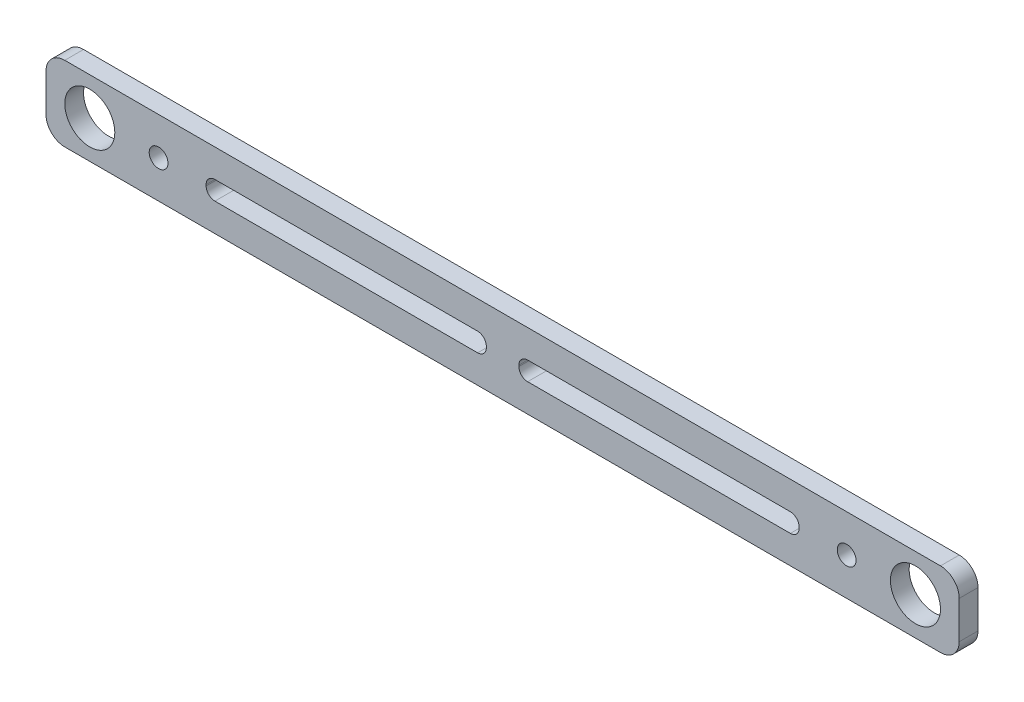
ISO-10303-21;
HEADER;
FILE_DESCRIPTION(('STEP AP214'),'2;1');
FILE_NAME('part.step','',(''),(''),'','','');
FILE_SCHEMA(('AUTOMOTIVE_DESIGN { 1 0 10303 214 1 1 1 1 }'));
ENDSEC;
DATA;
#1=APPLICATION_CONTEXT('core data for automotive mechanical design processes');
#2=APPLICATION_PROTOCOL_DEFINITION('international standard','automotive_design',2000,#1);
#3=PRODUCT_CONTEXT('',#1,'mechanical');
#4=PRODUCT('Part','Part','',(#3));
#5=PRODUCT_RELATED_PRODUCT_CATEGORY('part','',(#4));
#6=PRODUCT_DEFINITION_FORMATION('','',#4);
#7=PRODUCT_DEFINITION_CONTEXT('part definition',#1,'design');
#8=PRODUCT_DEFINITION('design','',#6,#7);
#9=PRODUCT_DEFINITION_SHAPE('','',#8);
#10=(LENGTH_UNIT() NAMED_UNIT(*) SI_UNIT(.MILLI.,.METRE.));
#11=(NAMED_UNIT(*) PLANE_ANGLE_UNIT() SI_UNIT($,.RADIAN.));
#12=(NAMED_UNIT(*) SI_UNIT($,.STERADIAN.) SOLID_ANGLE_UNIT());
#13=UNCERTAINTY_MEASURE_WITH_UNIT(LENGTH_MEASURE(1.E-05),#10,'distance_accuracy_value','');
#14=(GEOMETRIC_REPRESENTATION_CONTEXT(3) GLOBAL_UNCERTAINTY_ASSIGNED_CONTEXT((#13)) GLOBAL_UNIT_ASSIGNED_CONTEXT((#10,
#11,#12)) REPRESENTATION_CONTEXT('',''));
#15=CARTESIAN_POINT('',(0.,0.,0.));
#16=DIRECTION('',(0.,0.,1.));
#17=DIRECTION('',(1.,0.,0.));
#18=AXIS2_PLACEMENT_3D('',#15,#16,#17);
#19=CARTESIAN_POINT('',(70.,-3.,3.));
#20=DIRECTION('',(0.,0.,1.));
#21=DIRECTION('',(1.,0.,0.));
#22=AXIS2_PLACEMENT_3D('',#19,#20,#21);
#23=PLANE('',#22);
#24=DIRECTION('',(0.,1.,0.));
#25=VECTOR('',#24,1.);
#26=CARTESIAN_POINT('',(47.4,0.0999999999999987,3.));
#27=LINE('',#26,#25);
#28=CARTESIAN_POINT('',(47.4,-0.100000000000001,3.));
#29=VERTEX_POINT('',#28);
#30=CARTESIAN_POINT('',(47.4,0.0999999999999987,3.));
#31=VERTEX_POINT('',#30);
#32=EDGE_CURVE('E210',#29,#31,#27,.T.);
#33=ORIENTED_EDGE('',*,*,#32,.F.);
#34=CARTESIAN_POINT('',(46.,-0.100000000000002,3.));
#35=DIRECTION('',(0.,0.,1.));
#36=DIRECTION('',(-1.,0.,0.));
#37=AXIS2_PLACEMENT_3D('',#34,#35,#36);
#38=CIRCLE('',#37,1.4);
#39=CARTESIAN_POINT('',(46.,-1.5,3.));
#40=VERTEX_POINT('',#39);
#41=EDGE_CURVE('E201',#40,#29,#38,.T.);
#42=ORIENTED_EDGE('',*,*,#41,.F.);
#43=DIRECTION('',(1.,0.,0.));
#44=VECTOR('',#43,1.);
#45=CARTESIAN_POINT('',(4.00000000000001,-1.5,3.));
#46=LINE('',#45,#44);
#47=CARTESIAN_POINT('',(4.,-1.5,3.));
#48=VERTEX_POINT('',#47);
#49=EDGE_CURVE('E244',#48,#40,#46,.T.);
#50=ORIENTED_EDGE('',*,*,#49,.F.);
#51=CARTESIAN_POINT('',(4.00000000000001,-0.100000000000002,3.));
#52=DIRECTION('',(0.,0.,1.));
#53=DIRECTION('',(-1.,0.,0.));
#54=AXIS2_PLACEMENT_3D('',#51,#52,#53);
#55=CIRCLE('',#54,1.4);
#56=CARTESIAN_POINT('',(2.60000000000001,-0.100000000000002,3.));
#57=VERTEX_POINT('',#56);
#58=EDGE_CURVE('E241',#57,#48,#55,.T.);
#59=ORIENTED_EDGE('',*,*,#58,.F.);
#60=DIRECTION('',(0.,-1.,0.));
#61=VECTOR('',#60,1.);
#62=CARTESIAN_POINT('',(2.60000000000001,0.0999999999999984,3.));
#63=LINE('',#62,#61);
#64=CARTESIAN_POINT('',(2.60000000000001,0.0999999999999987,3.));
#65=VERTEX_POINT('',#64);
#66=EDGE_CURVE('E238',#65,#57,#63,.T.);
#67=ORIENTED_EDGE('',*,*,#66,.F.);
#68=CARTESIAN_POINT('',(4.00000000000001,0.0999999999999985,3.));
#69=DIRECTION('',(0.,0.,1.));
#70=DIRECTION('',(1.,0.,0.));
#71=AXIS2_PLACEMENT_3D('',#68,#69,#70);
#72=CIRCLE('',#71,1.4);
#73=CARTESIAN_POINT('',(4.00000000000001,1.5,3.));
#74=VERTEX_POINT('',#73);
#75=EDGE_CURVE('E235',#74,#65,#72,.T.);
#76=ORIENTED_EDGE('',*,*,#75,.F.);
#77=DIRECTION('',(-1.,0.,0.));
#78=VECTOR('',#77,1.);
#79=CARTESIAN_POINT('',(4.00000000000001,1.5,3.));
#80=LINE('',#79,#78);
#81=CARTESIAN_POINT('',(46.,1.49999999999999,3.));
#82=VERTEX_POINT('',#81);
#83=EDGE_CURVE('E229',#82,#74,#80,.T.);
#84=ORIENTED_EDGE('',*,*,#83,.F.);
#85=CARTESIAN_POINT('',(46.,0.0999999999999985,3.));
#86=DIRECTION('',(0.,0.,1.));
#87=DIRECTION('',(1.,0.,0.));
#88=AXIS2_PLACEMENT_3D('',#85,#86,#87);
#89=CIRCLE('',#88,1.4);
#90=EDGE_CURVE('E225',#31,#82,#89,.T.);
#91=ORIENTED_EDGE('',*,*,#90,.F.);
#92=EDGE_LOOP('',(#33,#42,#50,#59,#67,#76,#84,#91));
#93=FACE_BOUND('',#92,.T.);
#94=CARTESIAN_POINT('',(55.,0.,3.));
#95=DIRECTION('',(0.,0.,1.));
#96=DIRECTION('',(1.,0.,0.));
#97=AXIS2_PLACEMENT_3D('',#94,#95,#96);
#98=CIRCLE('',#97,1.5);
#99=CARTESIAN_POINT('',(56.5,0.,3.));
#100=VERTEX_POINT('',#99);
#101=EDGE_CURVE('E293',#100,#100,#98,.T.);
#102=ORIENTED_EDGE('',*,*,#101,.F.);
#103=EDGE_LOOP('',(#102));
#104=FACE_BOUND('',#103,.T.);
#105=CARTESIAN_POINT('',(-66.,0.,3.));
#106=DIRECTION('',(0.,0.,1.));
#107=DIRECTION('',(1.,0.,0.));
#108=AXIS2_PLACEMENT_3D('',#105,#106,#107);
#109=CIRCLE('',#108,4.00000000000001);
#110=CARTESIAN_POINT('',(-62.,0.,3.));
#111=VERTEX_POINT('',#110);
#112=EDGE_CURVE('E392',#111,#111,#109,.T.);
#113=ORIENTED_EDGE('',*,*,#112,.F.);
#114=EDGE_LOOP('',(#113));
#115=FACE_BOUND('',#114,.T.);
#116=CARTESIAN_POINT('',(70.,-3.,3.));
#117=DIRECTION('',(0.,0.,1.));
#118=DIRECTION('',(1.,0.,0.));
#119=AXIS2_PLACEMENT_3D('',#116,#117,#118);
#120=CIRCLE('',#119,3.);
#121=CARTESIAN_POINT('',(70.,-6.,3.));
#122=VERTEX_POINT('',#121);
#123=CARTESIAN_POINT('',(73.,-3.,3.));
#124=VERTEX_POINT('',#123);
#125=EDGE_CURVE('E400',#122,#124,#120,.T.);
#126=ORIENTED_EDGE('',*,*,#125,.T.);
#127=DIRECTION('',(0.,1.,0.));
#128=VECTOR('',#127,1.);
#129=CARTESIAN_POINT('',(73.,3.,3.));
#130=LINE('',#129,#128);
#131=CARTESIAN_POINT('',(73.,3.,3.));
#132=VERTEX_POINT('',#131);
#133=EDGE_CURVE('E404',#124,#132,#130,.T.);
#134=ORIENTED_EDGE('',*,*,#133,.T.);
#135=CARTESIAN_POINT('',(70.,3.,3.));
#136=DIRECTION('',(0.,0.,1.));
#137=DIRECTION('',(1.,0.,0.));
#138=AXIS2_PLACEMENT_3D('',#135,#136,#137);
#139=CIRCLE('',#138,3.);
#140=CARTESIAN_POINT('',(70.,6.,3.));
#141=VERTEX_POINT('',#140);
#142=EDGE_CURVE('E408',#132,#141,#139,.T.);
#143=ORIENTED_EDGE('',*,*,#142,.T.);
#144=DIRECTION('',(-1.,0.,0.));
#145=VECTOR('',#144,1.);
#146=CARTESIAN_POINT('',(-70.,6.,3.));
#147=LINE('',#146,#145);
#148=CARTESIAN_POINT('',(-70.,6.,3.));
#149=VERTEX_POINT('',#148);
#150=EDGE_CURVE('E411',#141,#149,#147,.T.);
#151=ORIENTED_EDGE('',*,*,#150,.T.);
#152=CARTESIAN_POINT('',(-70.,3.,3.));
#153=DIRECTION('',(0.,0.,1.));
#154=DIRECTION('',(1.,0.,0.));
#155=AXIS2_PLACEMENT_3D('',#152,#153,#154);
#156=CIRCLE('',#155,3.);
#157=CARTESIAN_POINT('',(-73.,3.,3.));
#158=VERTEX_POINT('',#157);
#159=EDGE_CURVE('E414',#149,#158,#156,.T.);
#160=ORIENTED_EDGE('',*,*,#159,.T.);
#161=DIRECTION('',(0.,-1.,0.));
#162=VECTOR('',#161,1.);
#163=CARTESIAN_POINT('',(-73.,3.,3.));
#164=LINE('',#163,#162);
#165=CARTESIAN_POINT('',(-73.,-3.,3.));
#166=VERTEX_POINT('',#165);
#167=EDGE_CURVE('E417',#158,#166,#164,.T.);
#168=ORIENTED_EDGE('',*,*,#167,.T.);
#169=CARTESIAN_POINT('',(-70.,-3.,3.));
#170=DIRECTION('',(0.,0.,1.));
#171=DIRECTION('',(-1.,0.,0.));
#172=AXIS2_PLACEMENT_3D('',#169,#170,#171);
#173=CIRCLE('',#172,3.);
#174=CARTESIAN_POINT('',(-70.,-6.,3.));
#175=VERTEX_POINT('',#174);
#176=EDGE_CURVE('E420',#166,#175,#173,.T.);
#177=ORIENTED_EDGE('',*,*,#176,.T.);
#178=DIRECTION('',(1.,0.,0.));
#179=VECTOR('',#178,1.);
#180=CARTESIAN_POINT('',(-70.,-6.,3.));
#181=LINE('',#180,#179);
#182=EDGE_CURVE('E423',#175,#122,#181,.T.);
#183=ORIENTED_EDGE('',*,*,#182,.T.);
#184=EDGE_LOOP('',(#126,#134,#143,#151,#160,#168,#177,#183));
#185=FACE_BOUND('',#184,.T.);
#186=CARTESIAN_POINT('',(66.,0.,3.));
#187=DIRECTION('',(0.,0.,1.));
#188=DIRECTION('',(1.,0.,0.));
#189=AXIS2_PLACEMENT_3D('',#186,#187,#188);
#190=CIRCLE('',#189,4.00000000000001);
#191=CARTESIAN_POINT('',(70.,0.,3.));
#192=VERTEX_POINT('',#191);
#193=EDGE_CURVE('E384',#192,#192,#190,.T.);
#194=ORIENTED_EDGE('',*,*,#193,.F.);
#195=EDGE_LOOP('',(#194));
#196=FACE_BOUND('',#195,.T.);
#197=DIRECTION('',(0.,1.,0.));
#198=VECTOR('',#197,1.);
#199=CARTESIAN_POINT('',(-2.6,0.0999999999999959,3.));
#200=LINE('',#199,#198);
#201=CARTESIAN_POINT('',(-2.6,-0.100000000000003,3.));
#202=VERTEX_POINT('',#201);
#203=CARTESIAN_POINT('',(-2.6,0.0999999999999959,3.));
#204=VERTEX_POINT('',#203);
#205=EDGE_CURVE('E304',#202,#204,#200,.T.);
#206=ORIENTED_EDGE('',*,*,#205,.F.);
#207=CARTESIAN_POINT('',(-4.,-0.100000000000003,3.));
#208=DIRECTION('',(0.,0.,1.));
#209=DIRECTION('',(-1.,0.,0.));
#210=AXIS2_PLACEMENT_3D('',#207,#208,#209);
#211=CIRCLE('',#210,1.4);
#212=CARTESIAN_POINT('',(-4.,-1.5,3.));
#213=VERTEX_POINT('',#212);
#214=EDGE_CURVE('E301',#213,#202,#211,.T.);
#215=ORIENTED_EDGE('',*,*,#214,.F.);
#216=DIRECTION('',(1.,0.,0.));
#217=VECTOR('',#216,1.);
#218=CARTESIAN_POINT('',(-46.,-1.5,3.));
#219=LINE('',#218,#217);
#220=CARTESIAN_POINT('',(-46.,-1.5,3.));
#221=VERTEX_POINT('',#220);
#222=EDGE_CURVE('E324',#221,#213,#219,.T.);
#223=ORIENTED_EDGE('',*,*,#222,.F.);
#224=CARTESIAN_POINT('',(-46.,-0.100000000000003,3.));
#225=DIRECTION('',(0.,0.,1.));
#226=DIRECTION('',(-1.,0.,0.));
#227=AXIS2_PLACEMENT_3D('',#224,#225,#226);
#228=CIRCLE('',#227,1.4);
#229=CARTESIAN_POINT('',(-47.4,-0.100000000000003,3.));
#230=VERTEX_POINT('',#229);
#231=EDGE_CURVE('E320',#230,#221,#228,.T.);
#232=ORIENTED_EDGE('',*,*,#231,.F.);
#233=DIRECTION('',(0.,-1.,0.));
#234=VECTOR('',#233,1.);
#235=CARTESIAN_POINT('',(-47.4,0.0999999999999959,3.));
#236=LINE('',#235,#234);
#237=CARTESIAN_POINT('',(-47.4,0.0999999999999961,3.));
#238=VERTEX_POINT('',#237);
#239=EDGE_CURVE('E317',#238,#230,#236,.T.);
#240=ORIENTED_EDGE('',*,*,#239,.F.);
#241=CARTESIAN_POINT('',(-46.,0.0999999999999959,3.));
#242=DIRECTION('',(0.,0.,1.));
#243=DIRECTION('',(1.,0.,0.));
#244=AXIS2_PLACEMENT_3D('',#241,#242,#243);
#245=CIRCLE('',#244,1.39999999999999);
#246=CARTESIAN_POINT('',(-46.,1.49999999999999,3.));
#247=VERTEX_POINT('',#246);
#248=EDGE_CURVE('E314',#247,#238,#245,.T.);
#249=ORIENTED_EDGE('',*,*,#248,.F.);
#250=DIRECTION('',(-1.,0.,0.));
#251=VECTOR('',#250,1.);
#252=CARTESIAN_POINT('',(-46.,1.49999999999999,3.));
#253=LINE('',#252,#251);
#254=CARTESIAN_POINT('',(-4.,1.5,3.));
#255=VERTEX_POINT('',#254);
#256=EDGE_CURVE('E311',#255,#247,#253,.T.);
#257=ORIENTED_EDGE('',*,*,#256,.F.);
#258=CARTESIAN_POINT('',(-4.,0.0999999999999959,3.));
#259=DIRECTION('',(0.,0.,1.));
#260=DIRECTION('',(1.,0.,0.));
#261=AXIS2_PLACEMENT_3D('',#258,#259,#260);
#262=CIRCLE('',#261,1.4);
#263=EDGE_CURVE('E308',#204,#255,#262,.T.);
#264=ORIENTED_EDGE('',*,*,#263,.F.);
#265=EDGE_LOOP('',(#206,#215,#223,#232,#240,#249,#257,#264));
#266=FACE_BOUND('',#265,.T.);
#267=CARTESIAN_POINT('',(-55.,0.,3.));
#268=DIRECTION('',(0.,0.,1.));
#269=DIRECTION('',(1.,0.,0.));
#270=AXIS2_PLACEMENT_3D('',#267,#268,#269);
#271=CIRCLE('',#270,1.5);
#272=CARTESIAN_POINT('',(-53.5,0.,3.));
#273=VERTEX_POINT('',#272);
#274=EDGE_CURVE('E249',#273,#273,#271,.T.);
#275=ORIENTED_EDGE('',*,*,#274,.F.);
#276=EDGE_LOOP('',(#275));
#277=FACE_BOUND('',#276,.T.);
#278=ADVANCED_FACE('F39',(#93,#104,#115,#185,#196,#266,#277),#23,.T.);
#279=CARTESIAN_POINT('',(70.,-3.,0.));
#280=DIRECTION('',(0.,0.,1.));
#281=DIRECTION('',(1.,0.,0.));
#282=AXIS2_PLACEMENT_3D('',#279,#280,#281);
#283=PLANE('',#282);
#284=CARTESIAN_POINT('',(55.,0.,0.));
#285=DIRECTION('',(0.,0.,1.));
#286=DIRECTION('',(1.,0.,0.));
#287=AXIS2_PLACEMENT_3D('',#284,#285,#286);
#288=CIRCLE('',#287,1.5);
#289=CARTESIAN_POINT('',(56.5,0.,0.));
#290=VERTEX_POINT('',#289);
#291=EDGE_CURVE('E219',#290,#290,#288,.T.);
#292=ORIENTED_EDGE('',*,*,#291,.T.);
#293=EDGE_LOOP('',(#292));
#294=FACE_BOUND('',#293,.T.);
#295=CARTESIAN_POINT('',(-4.,-0.100000000000003,0.));
#296=DIRECTION('',(0.,0.,1.));
#297=DIRECTION('',(-1.,0.,0.));
#298=AXIS2_PLACEMENT_3D('',#295,#296,#297);
#299=CIRCLE('',#298,1.4);
#300=CARTESIAN_POINT('',(-4.,-1.5,0.));
#301=VERTEX_POINT('',#300);
#302=CARTESIAN_POINT('',(-2.6,-0.100000000000003,0.));
#303=VERTEX_POINT('',#302);
#304=EDGE_CURVE('E297',#301,#303,#299,.T.);
#305=ORIENTED_EDGE('',*,*,#304,.T.);
#306=DIRECTION('',(0.,1.,0.));
#307=VECTOR('',#306,1.);
#308=CARTESIAN_POINT('',(-2.6,0.0999999999999959,0.));
#309=LINE('',#308,#307);
#310=CARTESIAN_POINT('',(-2.6,0.0999999999999959,0.));
#311=VERTEX_POINT('',#310);
#312=EDGE_CURVE('E331',#303,#311,#309,.T.);
#313=ORIENTED_EDGE('',*,*,#312,.T.);
#314=CARTESIAN_POINT('',(-4.,0.0999999999999959,0.));
#315=DIRECTION('',(0.,0.,1.));
#316=DIRECTION('',(1.,0.,0.));
#317=AXIS2_PLACEMENT_3D('',#314,#315,#316);
#318=CIRCLE('',#317,1.4);
#319=CARTESIAN_POINT('',(-4.,1.5,0.));
#320=VERTEX_POINT('',#319);
#321=EDGE_CURVE('E335',#311,#320,#318,.T.);
#322=ORIENTED_EDGE('',*,*,#321,.T.);
#323=DIRECTION('',(-1.,0.,0.));
#324=VECTOR('',#323,1.);
#325=CARTESIAN_POINT('',(-46.,1.49999999999999,0.));
#326=LINE('',#325,#324);
#327=CARTESIAN_POINT('',(-46.,1.49999999999999,0.));
#328=VERTEX_POINT('',#327);
#329=EDGE_CURVE('E339',#320,#328,#326,.T.);
#330=ORIENTED_EDGE('',*,*,#329,.T.);
#331=CARTESIAN_POINT('',(-46.,0.0999999999999959,0.));
#332=DIRECTION('',(0.,0.,1.));
#333=DIRECTION('',(1.,0.,0.));
#334=AXIS2_PLACEMENT_3D('',#331,#332,#333);
#335=CIRCLE('',#334,1.39999999999999);
#336=CARTESIAN_POINT('',(-47.4,0.0999999999999961,0.));
#337=VERTEX_POINT('',#336);
#338=EDGE_CURVE('E343',#328,#337,#335,.T.);
#339=ORIENTED_EDGE('',*,*,#338,.T.);
#340=DIRECTION('',(0.,-1.,0.));
#341=VECTOR('',#340,1.);
#342=CARTESIAN_POINT('',(-47.4,0.0999999999999959,0.));
#343=LINE('',#342,#341);
#344=CARTESIAN_POINT('',(-47.4,-0.100000000000003,0.));
#345=VERTEX_POINT('',#344);
#346=EDGE_CURVE('E347',#337,#345,#343,.T.);
#347=ORIENTED_EDGE('',*,*,#346,.T.);
#348=CARTESIAN_POINT('',(-46.,-0.100000000000003,0.));
#349=DIRECTION('',(0.,0.,1.));
#350=DIRECTION('',(-1.,0.,0.));
#351=AXIS2_PLACEMENT_3D('',#348,#349,#350);
#352=CIRCLE('',#351,1.4);
#353=CARTESIAN_POINT('',(-46.,-1.5,0.));
#354=VERTEX_POINT('',#353);
#355=EDGE_CURVE('E351',#345,#354,#352,.T.);
#356=ORIENTED_EDGE('',*,*,#355,.T.);
#357=DIRECTION('',(1.,0.,0.));
#358=VECTOR('',#357,1.);
#359=CARTESIAN_POINT('',(-46.,-1.5,0.));
#360=LINE('',#359,#358);
#361=EDGE_CURVE('E305',#354,#301,#360,.T.);
#362=ORIENTED_EDGE('',*,*,#361,.T.);
#363=EDGE_LOOP('',(#305,#313,#322,#330,#339,#347,#356,#362));
#364=FACE_BOUND('',#363,.T.);
#365=CARTESIAN_POINT('',(70.,-3.,0.));
#366=DIRECTION('',(0.,0.,1.));
#367=DIRECTION('',(1.,0.,0.));
#368=AXIS2_PLACEMENT_3D('',#365,#366,#367);
#369=CIRCLE('',#368,3.);
#370=CARTESIAN_POINT('',(70.,-6.,0.));
#371=VERTEX_POINT('',#370);
#372=CARTESIAN_POINT('',(73.,-3.,0.));
#373=VERTEX_POINT('',#372);
#374=EDGE_CURVE('E396',#371,#373,#369,.T.);
#375=ORIENTED_EDGE('',*,*,#374,.F.);
#376=DIRECTION('',(1.,0.,0.));
#377=VECTOR('',#376,1.);
#378=CARTESIAN_POINT('',(-70.,-6.,0.));
#379=LINE('',#378,#377);
#380=CARTESIAN_POINT('',(-70.,-6.,0.));
#381=VERTEX_POINT('',#380);
#382=EDGE_CURVE('E405',#381,#371,#379,.T.);
#383=ORIENTED_EDGE('',*,*,#382,.F.);
#384=CARTESIAN_POINT('',(-70.,-3.,0.));
#385=DIRECTION('',(0.,0.,1.));
#386=DIRECTION('',(-1.,0.,0.));
#387=AXIS2_PLACEMENT_3D('',#384,#385,#386);
#388=CIRCLE('',#387,3.);
#389=CARTESIAN_POINT('',(-73.,-3.,0.));
#390=VERTEX_POINT('',#389);
#391=EDGE_CURVE('E445',#390,#381,#388,.T.);
#392=ORIENTED_EDGE('',*,*,#391,.F.);
#393=DIRECTION('',(0.,-1.,0.));
#394=VECTOR('',#393,1.);
#395=CARTESIAN_POINT('',(-73.,3.,0.));
#396=LINE('',#395,#394);
#397=CARTESIAN_POINT('',(-73.,3.,0.));
#398=VERTEX_POINT('',#397);
#399=EDGE_CURVE('E442',#398,#390,#396,.T.);
#400=ORIENTED_EDGE('',*,*,#399,.F.);
#401=CARTESIAN_POINT('',(-70.,3.,0.));
#402=DIRECTION('',(0.,0.,1.));
#403=DIRECTION('',(1.,0.,0.));
#404=AXIS2_PLACEMENT_3D('',#401,#402,#403);
#405=CIRCLE('',#404,3.);
#406=CARTESIAN_POINT('',(-70.,6.,0.));
#407=VERTEX_POINT('',#406);
#408=EDGE_CURVE('E439',#407,#398,#405,.T.);
#409=ORIENTED_EDGE('',*,*,#408,.F.);
#410=DIRECTION('',(-1.,0.,0.));
#411=VECTOR('',#410,1.);
#412=CARTESIAN_POINT('',(-70.,6.,0.));
#413=LINE('',#412,#411);
#414=CARTESIAN_POINT('',(70.,6.,0.));
#415=VERTEX_POINT('',#414);
#416=EDGE_CURVE('E436',#415,#407,#413,.T.);
#417=ORIENTED_EDGE('',*,*,#416,.F.);
#418=CARTESIAN_POINT('',(70.,3.,0.));
#419=DIRECTION('',(0.,0.,1.));
#420=DIRECTION('',(1.,0.,0.));
#421=AXIS2_PLACEMENT_3D('',#418,#419,#420);
#422=CIRCLE('',#421,3.);
#423=CARTESIAN_POINT('',(73.,3.,0.));
#424=VERTEX_POINT('',#423);
#425=EDGE_CURVE('E433',#424,#415,#422,.T.);
#426=ORIENTED_EDGE('',*,*,#425,.F.);
#427=DIRECTION('',(0.,1.,0.));
#428=VECTOR('',#427,1.);
#429=CARTESIAN_POINT('',(73.,3.,0.));
#430=LINE('',#429,#428);
#431=EDGE_CURVE('E430',#373,#424,#430,.T.);
#432=ORIENTED_EDGE('',*,*,#431,.F.);
#433=EDGE_LOOP('',(#375,#383,#392,#400,#409,#417,#426,#432));
#434=FACE_BOUND('',#433,.T.);
#435=CARTESIAN_POINT('',(-66.,0.,0.));
#436=DIRECTION('',(0.,0.,1.));
#437=DIRECTION('',(1.,0.,0.));
#438=AXIS2_PLACEMENT_3D('',#435,#436,#437);
#439=CIRCLE('',#438,4.00000000000001);
#440=CARTESIAN_POINT('',(-62.,0.,0.));
#441=VERTEX_POINT('',#440);
#442=EDGE_CURVE('E388',#441,#441,#439,.T.);
#443=ORIENTED_EDGE('',*,*,#442,.T.);
#444=EDGE_LOOP('',(#443));
#445=FACE_BOUND('',#444,.T.);
#446=CARTESIAN_POINT('',(66.,0.,0.));
#447=DIRECTION('',(0.,0.,1.));
#448=DIRECTION('',(1.,0.,0.));
#449=AXIS2_PLACEMENT_3D('',#446,#447,#448);
#450=CIRCLE('',#449,4.00000000000001);
#451=CARTESIAN_POINT('',(70.,0.,0.));
#452=VERTEX_POINT('',#451);
#453=EDGE_CURVE('E383',#452,#452,#450,.T.);
#454=ORIENTED_EDGE('',*,*,#453,.T.);
#455=EDGE_LOOP('',(#454));
#456=FACE_BOUND('',#455,.T.);
#457=CARTESIAN_POINT('',(46.,-0.100000000000002,0.));
#458=DIRECTION('',(0.,0.,1.));
#459=DIRECTION('',(-1.,0.,0.));
#460=AXIS2_PLACEMENT_3D('',#457,#458,#459);
#461=CIRCLE('',#460,1.4);
#462=CARTESIAN_POINT('',(46.,-1.5,0.));
#463=VERTEX_POINT('',#462);
#464=CARTESIAN_POINT('',(47.4,-0.100000000000001,0.));
#465=VERTEX_POINT('',#464);
#466=EDGE_CURVE('E63',#463,#465,#461,.T.);
#467=ORIENTED_EDGE('',*,*,#466,.T.);
#468=DIRECTION('',(0.,1.,0.));
#469=VECTOR('',#468,1.);
#470=CARTESIAN_POINT('',(47.4,0.0999999999999987,0.));
#471=LINE('',#470,#469);
#472=CARTESIAN_POINT('',(47.4,0.0999999999999987,0.));
#473=VERTEX_POINT('',#472);
#474=EDGE_CURVE('E217',#465,#473,#471,.T.);
#475=ORIENTED_EDGE('',*,*,#474,.T.);
#476=CARTESIAN_POINT('',(46.,0.0999999999999985,0.));
#477=DIRECTION('',(0.,0.,1.));
#478=DIRECTION('',(1.,0.,0.));
#479=AXIS2_PLACEMENT_3D('',#476,#477,#478);
#480=CIRCLE('',#479,1.4);
#481=CARTESIAN_POINT('',(46.,1.49999999999999,0.));
#482=VERTEX_POINT('',#481);
#483=EDGE_CURVE('E252',#473,#482,#480,.T.);
#484=ORIENTED_EDGE('',*,*,#483,.T.);
#485=DIRECTION('',(-1.,0.,0.));
#486=VECTOR('',#485,1.);
#487=CARTESIAN_POINT('',(4.00000000000001,1.5,0.));
#488=LINE('',#487,#486);
#489=CARTESIAN_POINT('',(4.00000000000001,1.5,0.));
#490=VERTEX_POINT('',#489);
#491=EDGE_CURVE('E256',#482,#490,#488,.T.);
#492=ORIENTED_EDGE('',*,*,#491,.T.);
#493=CARTESIAN_POINT('',(4.00000000000001,0.0999999999999985,0.));
#494=DIRECTION('',(0.,0.,1.));
#495=DIRECTION('',(1.,0.,0.));
#496=AXIS2_PLACEMENT_3D('',#493,#494,#495);
#497=CIRCLE('',#496,1.4);
#498=CARTESIAN_POINT('',(2.60000000000001,0.0999999999999987,0.));
#499=VERTEX_POINT('',#498);
#500=EDGE_CURVE('E260',#490,#499,#497,.T.);
#501=ORIENTED_EDGE('',*,*,#500,.T.);
#502=DIRECTION('',(0.,-1.,0.));
#503=VECTOR('',#502,1.);
#504=CARTESIAN_POINT('',(2.60000000000001,0.0999999999999984,0.));
#505=LINE('',#504,#503);
#506=CARTESIAN_POINT('',(2.60000000000001,-0.100000000000002,0.));
#507=VERTEX_POINT('',#506);
#508=EDGE_CURVE('E264',#499,#507,#505,.T.);
#509=ORIENTED_EDGE('',*,*,#508,.T.);
#510=CARTESIAN_POINT('',(4.00000000000001,-0.100000000000002,0.));
#511=DIRECTION('',(0.,0.,1.));
#512=DIRECTION('',(-1.,0.,0.));
#513=AXIS2_PLACEMENT_3D('',#510,#511,#512);
#514=CIRCLE('',#513,1.4);
#515=CARTESIAN_POINT('',(4.00000000000001,-1.5,0.));
#516=VERTEX_POINT('',#515);
#517=EDGE_CURVE('E268',#507,#516,#514,.T.);
#518=ORIENTED_EDGE('',*,*,#517,.T.);
#519=DIRECTION('',(1.,0.,0.));
#520=VECTOR('',#519,1.);
#521=CARTESIAN_POINT('',(4.00000000000001,-1.5,0.));
#522=LINE('',#521,#520);
#523=EDGE_CURVE('E211',#516,#463,#522,.T.);
#524=ORIENTED_EDGE('',*,*,#523,.T.);
#525=EDGE_LOOP('',(#467,#475,#484,#492,#501,#509,#518,#524));
#526=FACE_BOUND('',#525,.T.);
#527=CARTESIAN_POINT('',(-55.,0.,0.));
#528=DIRECTION('',(0.,0.,1.));
#529=DIRECTION('',(1.,0.,0.));
#530=AXIS2_PLACEMENT_3D('',#527,#528,#529);
#531=CIRCLE('',#530,1.5);
#532=CARTESIAN_POINT('',(-53.5,0.,0.));
#533=VERTEX_POINT('',#532);
#534=EDGE_CURVE('E555',#533,#533,#531,.T.);
#535=ORIENTED_EDGE('',*,*,#534,.T.);
#536=EDGE_LOOP('',(#535));
#537=FACE_BOUND('',#536,.T.);
#538=ADVANCED_FACE('F484',(#294,#364,#434,#445,#456,#526,#537),#283,.F.);
#539=CARTESIAN_POINT('',(70.,-3.,3.));
#540=DIRECTION('',(0.,0.,-1.));
#541=DIRECTION('',(-1.,0.,0.));
#542=AXIS2_PLACEMENT_3D('',#539,#540,#541);
#543=CYLINDRICAL_SURFACE('',#542,3.);
#544=ORIENTED_EDGE('',*,*,#374,.T.);
#545=DIRECTION('',(0.,0.,-1.));
#546=VECTOR('',#545,1.);
#547=CARTESIAN_POINT('',(73.,-3.,3.));
#548=LINE('',#547,#546);
#549=EDGE_CURVE('E11',#124,#373,#548,.T.);
#550=ORIENTED_EDGE('',*,*,#549,.F.);
#551=ORIENTED_EDGE('',*,*,#125,.F.);
#552=DIRECTION('',(0.,0.,-1.));
#553=VECTOR('',#552,1.);
#554=CARTESIAN_POINT('',(70.,-6.,3.));
#555=LINE('',#554,#553);
#556=EDGE_CURVE('E426',#122,#371,#555,.T.);
#557=ORIENTED_EDGE('',*,*,#556,.T.);
#558=EDGE_LOOP('',(#544,#550,#551,#557));
#559=FACE_BOUND('',#558,.T.);
#560=ADVANCED_FACE('F41',(#559),#543,.T.);
#561=CARTESIAN_POINT('',(73.,3.,3.));
#562=DIRECTION('',(-1.,0.,0.));
#563=DIRECTION('',(0.,0.,1.));
#564=AXIS2_PLACEMENT_3D('',#561,#562,#563);
#565=PLANE('',#564);
#566=ORIENTED_EDGE('',*,*,#431,.T.);
#567=DIRECTION('',(0.,0.,-1.));
#568=VECTOR('',#567,1.);
#569=CARTESIAN_POINT('',(73.,3.,3.));
#570=LINE('',#569,#568);
#571=EDGE_CURVE('E48',#132,#424,#570,.T.);
#572=ORIENTED_EDGE('',*,*,#571,.F.);
#573=ORIENTED_EDGE('',*,*,#133,.F.);
#574=ORIENTED_EDGE('',*,*,#549,.T.);
#575=EDGE_LOOP('',(#566,#572,#573,#574));
#576=FACE_BOUND('',#575,.T.);
#577=ADVANCED_FACE('F502',(#576),#565,.F.);
#578=CARTESIAN_POINT('',(70.,3.,3.));
#579=DIRECTION('',(0.,0.,-1.));
#580=DIRECTION('',(-1.,0.,0.));
#581=AXIS2_PLACEMENT_3D('',#578,#579,#580);
#582=CYLINDRICAL_SURFACE('',#581,3.);
#583=ORIENTED_EDGE('',*,*,#425,.T.);
#584=DIRECTION('',(0.,0.,-1.));
#585=VECTOR('',#584,1.);
#586=CARTESIAN_POINT('',(70.,6.,3.));
#587=LINE('',#586,#585);
#588=EDGE_CURVE('E469',#141,#415,#587,.T.);
#589=ORIENTED_EDGE('',*,*,#588,.F.);
#590=ORIENTED_EDGE('',*,*,#142,.F.);
#591=ORIENTED_EDGE('',*,*,#571,.T.);
#592=EDGE_LOOP('',(#583,#589,#590,#591));
#593=FACE_BOUND('',#592,.T.);
#594=ADVANCED_FACE('F478',(#593),#582,.T.);
#595=CARTESIAN_POINT('',(-70.,6.,3.));
#596=DIRECTION('',(0.,-1.,0.));
#597=DIRECTION('',(0.,0.,-1.));
#598=AXIS2_PLACEMENT_3D('',#595,#596,#597);
#599=PLANE('',#598);
#600=ORIENTED_EDGE('',*,*,#416,.T.);
#601=DIRECTION('',(0.,0.,-1.));
#602=VECTOR('',#601,1.);
#603=CARTESIAN_POINT('',(-70.,6.,3.));
#604=LINE('',#603,#602);
#605=EDGE_CURVE('E465',#149,#407,#604,.T.);
#606=ORIENTED_EDGE('',*,*,#605,.F.);
#607=ORIENTED_EDGE('',*,*,#150,.F.);
#608=ORIENTED_EDGE('',*,*,#588,.T.);
#609=EDGE_LOOP('',(#600,#606,#607,#608));
#610=FACE_BOUND('',#609,.T.);
#611=ADVANCED_FACE('F490',(#610),#599,.F.);
#612=CARTESIAN_POINT('',(-70.,3.,3.));
#613=DIRECTION('',(0.,0.,-1.));
#614=DIRECTION('',(-1.,0.,0.));
#615=AXIS2_PLACEMENT_3D('',#612,#613,#614);
#616=CYLINDRICAL_SURFACE('',#615,3.);
#617=ORIENTED_EDGE('',*,*,#408,.T.);
#618=DIRECTION('',(0.,0.,-1.));
#619=VECTOR('',#618,1.);
#620=CARTESIAN_POINT('',(-73.,3.,3.));
#621=LINE('',#620,#619);
#622=EDGE_CURVE('E461',#158,#398,#621,.T.);
#623=ORIENTED_EDGE('',*,*,#622,.F.);
#624=ORIENTED_EDGE('',*,*,#159,.F.);
#625=ORIENTED_EDGE('',*,*,#605,.T.);
#626=EDGE_LOOP('',(#617,#623,#624,#625));
#627=FACE_BOUND('',#626,.T.);
#628=ADVANCED_FACE('F494',(#627),#616,.T.);
#629=CARTESIAN_POINT('',(-73.,3.,3.));
#630=DIRECTION('',(1.,0.,0.));
#631=DIRECTION('',(0.,0.,-1.));
#632=AXIS2_PLACEMENT_3D('',#629,#630,#631);
#633=PLANE('',#632);
#634=ORIENTED_EDGE('',*,*,#399,.T.);
#635=DIRECTION('',(0.,0.,-1.));
#636=VECTOR('',#635,1.);
#637=CARTESIAN_POINT('',(-73.,-3.,3.));
#638=LINE('',#637,#636);
#639=EDGE_CURVE('E457',#166,#390,#638,.T.);
#640=ORIENTED_EDGE('',*,*,#639,.F.);
#641=ORIENTED_EDGE('',*,*,#167,.F.);
#642=ORIENTED_EDGE('',*,*,#622,.T.);
#643=EDGE_LOOP('',(#634,#640,#641,#642));
#644=FACE_BOUND('',#643,.T.);
#645=ADVANCED_FACE('F515',(#644),#633,.F.);
#646=CARTESIAN_POINT('',(-70.,-3.,3.));
#647=DIRECTION('',(0.,0.,-1.));
#648=DIRECTION('',(-1.,0.,0.));
#649=AXIS2_PLACEMENT_3D('',#646,#647,#648);
#650=CYLINDRICAL_SURFACE('',#649,3.);
#651=ORIENTED_EDGE('',*,*,#391,.T.);
#652=DIRECTION('',(0.,0.,-1.));
#653=VECTOR('',#652,1.);
#654=CARTESIAN_POINT('',(-70.,-6.,3.));
#655=LINE('',#654,#653);
#656=EDGE_CURVE('E453',#175,#381,#655,.T.);
#657=ORIENTED_EDGE('',*,*,#656,.F.);
#658=ORIENTED_EDGE('',*,*,#176,.F.);
#659=ORIENTED_EDGE('',*,*,#639,.T.);
#660=EDGE_LOOP('',(#651,#657,#658,#659));
#661=FACE_BOUND('',#660,.T.);
#662=ADVANCED_FACE('F513',(#661),#650,.T.);
#663=CARTESIAN_POINT('',(-70.,-6.,3.));
#664=DIRECTION('',(0.,1.,0.));
#665=DIRECTION('',(0.,0.,1.));
#666=AXIS2_PLACEMENT_3D('',#663,#664,#665);
#667=PLANE('',#666);
#668=ORIENTED_EDGE('',*,*,#382,.T.);
#669=ORIENTED_EDGE('',*,*,#556,.F.);
#670=ORIENTED_EDGE('',*,*,#182,.F.);
#671=ORIENTED_EDGE('',*,*,#656,.T.);
#672=EDGE_LOOP('',(#668,#669,#670,#671));
#673=FACE_BOUND('',#672,.T.);
#674=ADVANCED_FACE('F508',(#673),#667,.F.);
#675=CARTESIAN_POINT('',(-66.,0.,3.));
#676=DIRECTION('',(0.,0.,-1.));
#677=DIRECTION('',(-1.,0.,0.));
#678=AXIS2_PLACEMENT_3D('',#675,#676,#677);
#679=CYLINDRICAL_SURFACE('',#678,4.00000000000001);
#680=ORIENTED_EDGE('',*,*,#112,.T.);
#681=EDGE_LOOP('',(#680));
#682=FACE_BOUND('',#681,.T.);
#683=ORIENTED_EDGE('',*,*,#442,.F.);
#684=EDGE_LOOP('',(#683));
#685=FACE_BOUND('',#684,.T.);
#686=ADVANCED_FACE('F532',(#682,#685),#679,.F.);
#687=CARTESIAN_POINT('',(66.,0.,3.));
#688=DIRECTION('',(0.,0.,-1.));
#689=DIRECTION('',(-1.,0.,0.));
#690=AXIS2_PLACEMENT_3D('',#687,#688,#689);
#691=CYLINDRICAL_SURFACE('',#690,4.00000000000001);
#692=ORIENTED_EDGE('',*,*,#193,.T.);
#693=EDGE_LOOP('',(#692));
#694=FACE_BOUND('',#693,.T.);
#695=ORIENTED_EDGE('',*,*,#453,.F.);
#696=EDGE_LOOP('',(#695));
#697=FACE_BOUND('',#696,.T.);
#698=ADVANCED_FACE('F539',(#694,#697),#691,.F.);
#699=CARTESIAN_POINT('',(-4.,-0.100000000000003,3.));
#700=DIRECTION('',(0.,0.,-1.));
#701=DIRECTION('',(-1.,0.,0.));
#702=AXIS2_PLACEMENT_3D('',#699,#700,#701);
#703=CYLINDRICAL_SURFACE('',#702,1.4);
#704=ORIENTED_EDGE('',*,*,#304,.F.);
#705=DIRECTION('',(0.,0.,-1.));
#706=VECTOR('',#705,1.);
#707=CARTESIAN_POINT('',(-4.,-1.5,3.));
#708=LINE('',#707,#706);
#709=EDGE_CURVE('E327',#213,#301,#708,.T.);
#710=ORIENTED_EDGE('',*,*,#709,.F.);
#711=ORIENTED_EDGE('',*,*,#214,.T.);
#712=DIRECTION('',(0.,0.,-1.));
#713=VECTOR('',#712,1.);
#714=CARTESIAN_POINT('',(-2.6,-0.100000000000003,3.));
#715=LINE('',#714,#713);
#716=EDGE_CURVE('E379',#202,#303,#715,.T.);
#717=ORIENTED_EDGE('',*,*,#716,.T.);
#718=EDGE_LOOP('',(#704,#710,#711,#717));
#719=FACE_BOUND('',#718,.T.);
#720=ADVANCED_FACE('F544',(#719),#703,.F.);
#721=CARTESIAN_POINT('',(-2.6,0.0999999999999959,3.));
#722=DIRECTION('',(-1.,0.,0.));
#723=DIRECTION('',(0.,0.,1.));
#724=AXIS2_PLACEMENT_3D('',#721,#722,#723);
#725=PLANE('',#724);
#726=ORIENTED_EDGE('',*,*,#312,.F.);
#727=ORIENTED_EDGE('',*,*,#716,.F.);
#728=ORIENTED_EDGE('',*,*,#205,.T.);
#729=DIRECTION('',(0.,0.,-1.));
#730=VECTOR('',#729,1.);
#731=CARTESIAN_POINT('',(-2.6,0.0999999999999959,3.));
#732=LINE('',#731,#730);
#733=EDGE_CURVE('E376',#204,#311,#732,.T.);
#734=ORIENTED_EDGE('',*,*,#733,.T.);
#735=EDGE_LOOP('',(#726,#727,#728,#734));
#736=FACE_BOUND('',#735,.T.);
#737=ADVANCED_FACE('F624',(#736),#725,.T.);
#738=CARTESIAN_POINT('',(-4.,0.0999999999999959,3.));
#739=DIRECTION('',(0.,0.,-1.));
#740=DIRECTION('',(-1.,0.,0.));
#741=AXIS2_PLACEMENT_3D('',#738,#739,#740);
#742=CYLINDRICAL_SURFACE('',#741,1.4);
#743=ORIENTED_EDGE('',*,*,#321,.F.);
#744=ORIENTED_EDGE('',*,*,#733,.F.);
#745=ORIENTED_EDGE('',*,*,#263,.T.);
#746=DIRECTION('',(0.,0.,-1.));
#747=VECTOR('',#746,1.);
#748=CARTESIAN_POINT('',(-4.,1.5,3.));
#749=LINE('',#748,#747);
#750=EDGE_CURVE('E373',#255,#320,#749,.T.);
#751=ORIENTED_EDGE('',*,*,#750,.T.);
#752=EDGE_LOOP('',(#743,#744,#745,#751));
#753=FACE_BOUND('',#752,.T.);
#754=ADVANCED_FACE('F620',(#753),#742,.F.);
#755=CARTESIAN_POINT('',(-46.,1.49999999999999,3.));
#756=DIRECTION('',(0.,-1.,0.));
#757=DIRECTION('',(0.,0.,-1.));
#758=AXIS2_PLACEMENT_3D('',#755,#756,#757);
#759=PLANE('',#758);
#760=ORIENTED_EDGE('',*,*,#329,.F.);
#761=ORIENTED_EDGE('',*,*,#750,.F.);
#762=ORIENTED_EDGE('',*,*,#256,.T.);
#763=DIRECTION('',(0.,0.,-1.));
#764=VECTOR('',#763,1.);
#765=CARTESIAN_POINT('',(-46.,1.49999999999999,3.));
#766=LINE('',#765,#764);
#767=EDGE_CURVE('E370',#247,#328,#766,.T.);
#768=ORIENTED_EDGE('',*,*,#767,.T.);
#769=EDGE_LOOP('',(#760,#761,#762,#768));
#770=FACE_BOUND('',#769,.T.);
#771=ADVANCED_FACE('F616',(#770),#759,.T.);
#772=CARTESIAN_POINT('',(-46.,0.0999999999999959,3.));
#773=DIRECTION('',(0.,0.,-1.));
#774=DIRECTION('',(-1.,0.,0.));
#775=AXIS2_PLACEMENT_3D('',#772,#773,#774);
#776=CYLINDRICAL_SURFACE('',#775,1.39999999999999);
#777=ORIENTED_EDGE('',*,*,#338,.F.);
#778=ORIENTED_EDGE('',*,*,#767,.F.);
#779=ORIENTED_EDGE('',*,*,#248,.T.);
#780=DIRECTION('',(0.,0.,-1.));
#781=VECTOR('',#780,1.);
#782=CARTESIAN_POINT('',(-47.4,0.0999999999999961,3.));
#783=LINE('',#782,#781);
#784=EDGE_CURVE('E367',#238,#337,#783,.T.);
#785=ORIENTED_EDGE('',*,*,#784,.T.);
#786=EDGE_LOOP('',(#777,#778,#779,#785));
#787=FACE_BOUND('',#786,.T.);
#788=ADVANCED_FACE('F612',(#787),#776,.F.);
#789=CARTESIAN_POINT('',(-47.4,0.0999999999999959,3.));
#790=DIRECTION('',(1.,0.,0.));
#791=DIRECTION('',(0.,1.,0.));
#792=AXIS2_PLACEMENT_3D('',#789,#790,#791);
#793=PLANE('',#792);
#794=ORIENTED_EDGE('',*,*,#346,.F.);
#795=ORIENTED_EDGE('',*,*,#784,.F.);
#796=ORIENTED_EDGE('',*,*,#239,.T.);
#797=DIRECTION('',(0.,0.,-1.));
#798=VECTOR('',#797,1.);
#799=CARTESIAN_POINT('',(-47.4,-0.100000000000003,3.));
#800=LINE('',#799,#798);
#801=EDGE_CURVE('E364',#230,#345,#800,.T.);
#802=ORIENTED_EDGE('',*,*,#801,.T.);
#803=EDGE_LOOP('',(#794,#795,#796,#802));
#804=FACE_BOUND('',#803,.T.);
#805=ADVANCED_FACE('F608',(#804),#793,.T.);
#806=CARTESIAN_POINT('',(-46.,-0.100000000000003,3.));
#807=DIRECTION('',(0.,0.,-1.));
#808=DIRECTION('',(-1.,0.,0.));
#809=AXIS2_PLACEMENT_3D('',#806,#807,#808);
#810=CYLINDRICAL_SURFACE('',#809,1.4);
#811=ORIENTED_EDGE('',*,*,#355,.F.);
#812=ORIENTED_EDGE('',*,*,#801,.F.);
#813=ORIENTED_EDGE('',*,*,#231,.T.);
#814=DIRECTION('',(0.,0.,-1.));
#815=VECTOR('',#814,1.);
#816=CARTESIAN_POINT('',(-46.,-1.5,3.));
#817=LINE('',#816,#815);
#818=EDGE_CURVE('E361',#221,#354,#817,.T.);
#819=ORIENTED_EDGE('',*,*,#818,.T.);
#820=EDGE_LOOP('',(#811,#812,#813,#819));
#821=FACE_BOUND('',#820,.T.);
#822=ADVANCED_FACE('F604',(#821),#810,.F.);
#823=CARTESIAN_POINT('',(-46.,-1.5,3.));
#824=DIRECTION('',(0.,1.,0.));
#825=DIRECTION('',(0.,0.,1.));
#826=AXIS2_PLACEMENT_3D('',#823,#824,#825);
#827=PLANE('',#826);
#828=ORIENTED_EDGE('',*,*,#361,.F.);
#829=ORIENTED_EDGE('',*,*,#818,.F.);
#830=ORIENTED_EDGE('',*,*,#222,.T.);
#831=ORIENTED_EDGE('',*,*,#709,.T.);
#832=EDGE_LOOP('',(#828,#829,#830,#831));
#833=FACE_BOUND('',#832,.T.);
#834=ADVANCED_FACE('F600',(#833),#827,.T.);
#835=CARTESIAN_POINT('',(55.,0.,3.));
#836=DIRECTION('',(0.,0.,-1.));
#837=DIRECTION('',(-1.,0.,0.));
#838=AXIS2_PLACEMENT_3D('',#835,#836,#837);
#839=CYLINDRICAL_SURFACE('',#838,1.5);
#840=ORIENTED_EDGE('',*,*,#101,.T.);
#841=EDGE_LOOP('',(#840));
#842=FACE_BOUND('',#841,.T.);
#843=ORIENTED_EDGE('',*,*,#291,.F.);
#844=EDGE_LOOP('',(#843));
#845=FACE_BOUND('',#844,.T.);
#846=ADVANCED_FACE('F597',(#842,#845),#839,.F.);
#847=CARTESIAN_POINT('',(46.,-0.100000000000002,3.));
#848=DIRECTION('',(0.,0.,-1.));
#849=DIRECTION('',(-1.,0.,0.));
#850=AXIS2_PLACEMENT_3D('',#847,#848,#849);
#851=CYLINDRICAL_SURFACE('',#850,1.4);
#852=ORIENTED_EDGE('',*,*,#466,.F.);
#853=DIRECTION('',(0.,0.,-1.));
#854=VECTOR('',#853,1.);
#855=CARTESIAN_POINT('',(46.,-1.5,3.));
#856=LINE('',#855,#854);
#857=EDGE_CURVE('E205',#40,#463,#856,.T.);
#858=ORIENTED_EDGE('',*,*,#857,.F.);
#859=ORIENTED_EDGE('',*,*,#41,.T.);
#860=DIRECTION('',(0.,0.,-1.));
#861=VECTOR('',#860,1.);
#862=CARTESIAN_POINT('',(47.4,-0.100000000000001,3.));
#863=LINE('',#862,#861);
#864=EDGE_CURVE('E204',#29,#465,#863,.T.);
#865=ORIENTED_EDGE('',*,*,#864,.T.);
#866=EDGE_LOOP('',(#852,#858,#859,#865));
#867=FACE_BOUND('',#866,.T.);
#868=ADVANCED_FACE('F203',(#867),#851,.F.);
#869=CARTESIAN_POINT('',(47.4,0.0999999999999987,3.));
#870=DIRECTION('',(-1.,0.,0.));
#871=DIRECTION('',(0.,-1.,0.));
#872=AXIS2_PLACEMENT_3D('',#869,#870,#871);
#873=PLANE('',#872);
#874=ORIENTED_EDGE('',*,*,#474,.F.);
#875=ORIENTED_EDGE('',*,*,#864,.F.);
#876=ORIENTED_EDGE('',*,*,#32,.T.);
#877=DIRECTION('',(0.,0.,-1.));
#878=VECTOR('',#877,1.);
#879=CARTESIAN_POINT('',(47.4,0.0999999999999987,3.));
#880=LINE('',#879,#878);
#881=EDGE_CURVE('E220',#31,#473,#880,.T.);
#882=ORIENTED_EDGE('',*,*,#881,.T.);
#883=EDGE_LOOP('',(#874,#875,#876,#882));
#884=FACE_BOUND('',#883,.T.);
#885=ADVANCED_FACE('F214',(#884),#873,.T.);
#886=CARTESIAN_POINT('',(46.,0.0999999999999985,3.));
#887=DIRECTION('',(0.,0.,-1.));
#888=DIRECTION('',(-1.,0.,0.));
#889=AXIS2_PLACEMENT_3D('',#886,#887,#888);
#890=CYLINDRICAL_SURFACE('',#889,1.4);
#891=ORIENTED_EDGE('',*,*,#483,.F.);
#892=ORIENTED_EDGE('',*,*,#881,.F.);
#893=ORIENTED_EDGE('',*,*,#90,.T.);
#894=DIRECTION('',(0.,0.,-1.));
#895=VECTOR('',#894,1.);
#896=CARTESIAN_POINT('',(46.,1.49999999999999,3.));
#897=LINE('',#896,#895);
#898=EDGE_CURVE('E288',#82,#482,#897,.T.);
#899=ORIENTED_EDGE('',*,*,#898,.T.);
#900=EDGE_LOOP('',(#891,#892,#893,#899));
#901=FACE_BOUND('',#900,.T.);
#902=ADVANCED_FACE('F588',(#901),#890,.F.);
#903=CARTESIAN_POINT('',(4.00000000000001,1.5,3.));
#904=DIRECTION('',(0.,-1.,0.));
#905=DIRECTION('',(0.,0.,-1.));
#906=AXIS2_PLACEMENT_3D('',#903,#904,#905);
#907=PLANE('',#906);
#908=ORIENTED_EDGE('',*,*,#491,.F.);
#909=ORIENTED_EDGE('',*,*,#898,.F.);
#910=ORIENTED_EDGE('',*,*,#83,.T.);
#911=DIRECTION('',(0.,0.,-1.));
#912=VECTOR('',#911,1.);
#913=CARTESIAN_POINT('',(4.00000000000001,1.5,3.));
#914=LINE('',#913,#912);
#915=EDGE_CURVE('E285',#74,#490,#914,.T.);
#916=ORIENTED_EDGE('',*,*,#915,.T.);
#917=EDGE_LOOP('',(#908,#909,#910,#916));
#918=FACE_BOUND('',#917,.T.);
#919=ADVANCED_FACE('F584',(#918),#907,.T.);
#920=CARTESIAN_POINT('',(4.00000000000001,0.0999999999999985,3.));
#921=DIRECTION('',(0.,0.,-1.));
#922=DIRECTION('',(-1.,0.,0.));
#923=AXIS2_PLACEMENT_3D('',#920,#921,#922);
#924=CYLINDRICAL_SURFACE('',#923,1.4);
#925=ORIENTED_EDGE('',*,*,#500,.F.);
#926=ORIENTED_EDGE('',*,*,#915,.F.);
#927=ORIENTED_EDGE('',*,*,#75,.T.);
#928=DIRECTION('',(0.,0.,-1.));
#929=VECTOR('',#928,1.);
#930=CARTESIAN_POINT('',(2.60000000000001,0.0999999999999987,3.));
#931=LINE('',#930,#929);
#932=EDGE_CURVE('E282',#65,#499,#931,.T.);
#933=ORIENTED_EDGE('',*,*,#932,.T.);
#934=EDGE_LOOP('',(#925,#926,#927,#933));
#935=FACE_BOUND('',#934,.T.);
#936=ADVANCED_FACE('F580',(#935),#924,.F.);
#937=CARTESIAN_POINT('',(2.60000000000001,0.0999999999999984,3.));
#938=DIRECTION('',(1.,0.,0.));
#939=DIRECTION('',(0.,0.,-1.));
#940=AXIS2_PLACEMENT_3D('',#937,#938,#939);
#941=PLANE('',#940);
#942=ORIENTED_EDGE('',*,*,#508,.F.);
#943=ORIENTED_EDGE('',*,*,#932,.F.);
#944=ORIENTED_EDGE('',*,*,#66,.T.);
#945=DIRECTION('',(0.,0.,-1.));
#946=VECTOR('',#945,1.);
#947=CARTESIAN_POINT('',(2.60000000000001,-0.100000000000002,3.));
#948=LINE('',#947,#946);
#949=EDGE_CURVE('E279',#57,#507,#948,.T.);
#950=ORIENTED_EDGE('',*,*,#949,.T.);
#951=EDGE_LOOP('',(#942,#943,#944,#950));
#952=FACE_BOUND('',#951,.T.);
#953=ADVANCED_FACE('F576',(#952),#941,.T.);
#954=CARTESIAN_POINT('',(4.00000000000001,-0.100000000000002,3.));
#955=DIRECTION('',(0.,0.,-1.));
#956=DIRECTION('',(-1.,0.,0.));
#957=AXIS2_PLACEMENT_3D('',#954,#955,#956);
#958=CYLINDRICAL_SURFACE('',#957,1.4);
#959=ORIENTED_EDGE('',*,*,#517,.F.);
#960=ORIENTED_EDGE('',*,*,#949,.F.);
#961=ORIENTED_EDGE('',*,*,#58,.T.);
#962=DIRECTION('',(0.,0.,-1.));
#963=VECTOR('',#962,1.);
#964=CARTESIAN_POINT('',(4.00000000000001,-1.5,3.));
#965=LINE('',#964,#963);
#966=EDGE_CURVE('E55',#48,#516,#965,.T.);
#967=ORIENTED_EDGE('',*,*,#966,.T.);
#968=EDGE_LOOP('',(#959,#960,#961,#967));
#969=FACE_BOUND('',#968,.T.);
#970=ADVANCED_FACE('F571',(#969),#958,.F.);
#971=CARTESIAN_POINT('',(4.00000000000001,-1.5,3.));
#972=DIRECTION('',(0.,1.,0.));
#973=DIRECTION('',(0.,0.,1.));
#974=AXIS2_PLACEMENT_3D('',#971,#972,#973);
#975=PLANE('',#974);
#976=ORIENTED_EDGE('',*,*,#523,.F.);
#977=ORIENTED_EDGE('',*,*,#966,.F.);
#978=ORIENTED_EDGE('',*,*,#49,.T.);
#979=ORIENTED_EDGE('',*,*,#857,.T.);
#980=EDGE_LOOP('',(#976,#977,#978,#979));
#981=FACE_BOUND('',#980,.T.);
#982=ADVANCED_FACE('F566',(#981),#975,.T.);
#983=CARTESIAN_POINT('',(-55.,0.,3.));
#984=DIRECTION('',(0.,0.,-1.));
#985=DIRECTION('',(-1.,0.,0.));
#986=AXIS2_PLACEMENT_3D('',#983,#984,#985);
#987=CYLINDRICAL_SURFACE('',#986,1.5);
#988=ORIENTED_EDGE('',*,*,#274,.T.);
#989=EDGE_LOOP('',(#988));
#990=FACE_BOUND('',#989,.T.);
#991=ORIENTED_EDGE('',*,*,#534,.F.);
#992=EDGE_LOOP('',(#991));
#993=FACE_BOUND('',#992,.T.);
#994=ADVANCED_FACE('F563',(#990,#993),#987,.F.);
#995=CLOSED_SHELL('',(#278,#538,#560,#577,#594,#611,#628,#645,#662,#674,#686,#698,#720,#737,
#754,#771,#788,#805,#822,#834,#846,#868,#885,#902,#919,#936,#953,#970,#982,#994));
#996=MANIFOLD_SOLID_BREP('B2',#995);
#997=ADVANCED_BREP_SHAPE_REPRESENTATION('',(#18,#996),#14);
#998=SHAPE_DEFINITION_REPRESENTATION(#9,#997);
ENDSEC;
END-ISO-10303-21;
